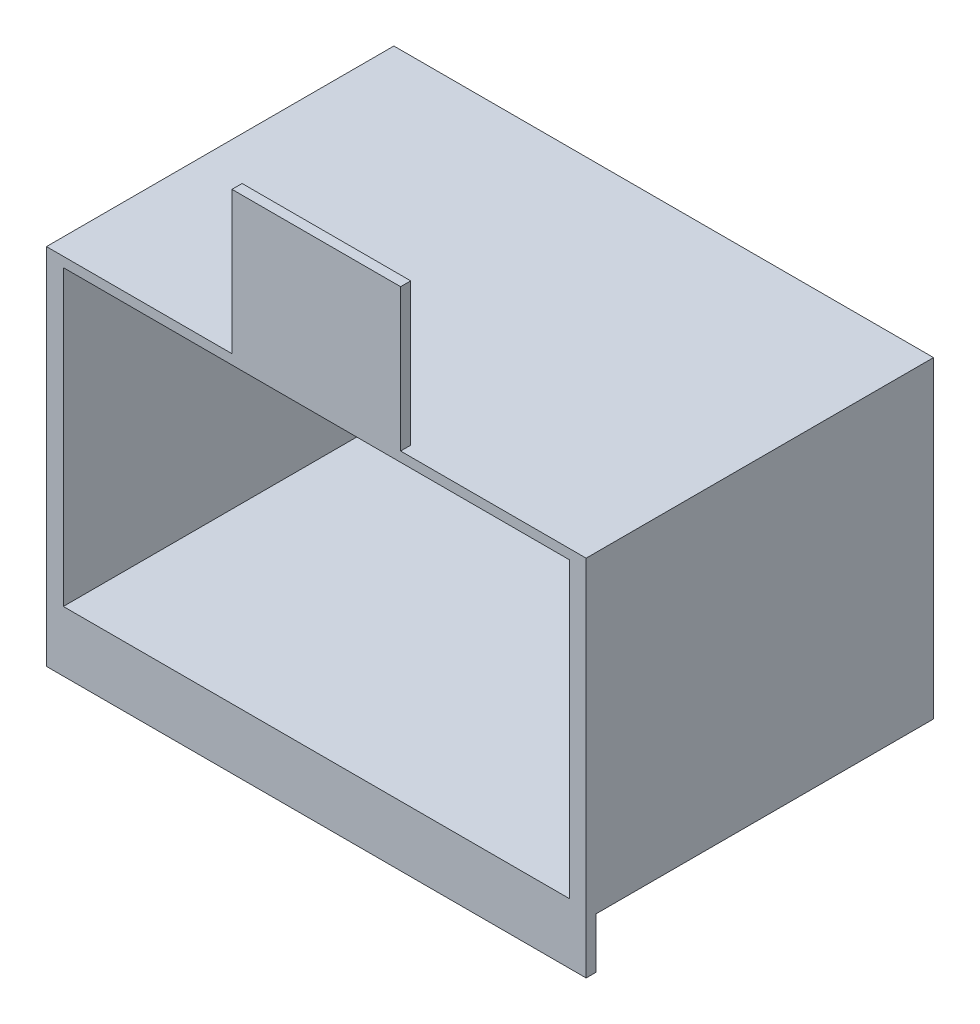
ISO-10303-21;
HEADER;
FILE_DESCRIPTION(('STEP AP214'),'2;1');
FILE_NAME('part.step','',(''),(''),'','','');
FILE_SCHEMA(('AUTOMOTIVE_DESIGN { 1 0 10303 214 1 1 1 1 }'));
ENDSEC;
DATA;
#1=APPLICATION_CONTEXT('core data for automotive mechanical design processes');
#2=APPLICATION_PROTOCOL_DEFINITION('international standard','automotive_design',2000,#1);
#3=PRODUCT_CONTEXT('',#1,'mechanical');
#4=PRODUCT('Part','Part','',(#3));
#5=PRODUCT_RELATED_PRODUCT_CATEGORY('part','',(#4));
#6=PRODUCT_DEFINITION_FORMATION('','',#4);
#7=PRODUCT_DEFINITION_CONTEXT('part definition',#1,'design');
#8=PRODUCT_DEFINITION('design','',#6,#7);
#9=PRODUCT_DEFINITION_SHAPE('','',#8);
#10=(LENGTH_UNIT() NAMED_UNIT(*) SI_UNIT(.MILLI.,.METRE.));
#11=(NAMED_UNIT(*) PLANE_ANGLE_UNIT() SI_UNIT($,.RADIAN.));
#12=(NAMED_UNIT(*) SI_UNIT($,.STERADIAN.) SOLID_ANGLE_UNIT());
#13=UNCERTAINTY_MEASURE_WITH_UNIT(LENGTH_MEASURE(1.E-05),#10,'distance_accuracy_value','');
#14=(GEOMETRIC_REPRESENTATION_CONTEXT(3) GLOBAL_UNCERTAINTY_ASSIGNED_CONTEXT((#13)) GLOBAL_UNIT_ASSIGNED_CONTEXT((#10,
#11,#12)) REPRESENTATION_CONTEXT('',''));
#15=CARTESIAN_POINT('',(0.,0.,0.));
#16=DIRECTION('',(0.,0.,1.));
#17=DIRECTION('',(1.,0.,0.));
#18=AXIS2_PLACEMENT_3D('',#15,#16,#17);
#19=CARTESIAN_POINT('',(80.,75.,3.));
#20=DIRECTION('',(-1.,0.,0.));
#21=DIRECTION('',(0.,-1.,0.));
#22=AXIS2_PLACEMENT_3D('',#19,#20,#21);
#23=PLANE('',#22);
#24=DIRECTION('',(0.,0.,-1.));
#25=VECTOR('',#24,1.);
#26=CARTESIAN_POINT('',(80.,-60.,103.));
#27=LINE('',#26,#25);
#28=CARTESIAN_POINT('',(80.,-60.,100.));
#29=VERTEX_POINT('',#28);
#30=CARTESIAN_POINT('',(80.,-60.,0.));
#31=VERTEX_POINT('',#30);
#32=EDGE_CURVE('E138',#29,#31,#27,.T.);
#33=ORIENTED_EDGE('',*,*,#32,.T.);
#34=DIRECTION('',(0.,1.,0.));
#35=VECTOR('',#34,1.);
#36=CARTESIAN_POINT('',(80.,75.,0.));
#37=LINE('',#36,#35);
#38=CARTESIAN_POINT('',(80.,32.8,0.));
#39=VERTEX_POINT('',#38);
#40=EDGE_CURVE('E44',#31,#39,#37,.T.);
#41=ORIENTED_EDGE('',*,*,#40,.T.);
#42=DIRECTION('',(0.,0.,-1.));
#43=VECTOR('',#42,1.);
#44=CARTESIAN_POINT('',(80.,32.8,103.));
#45=LINE('',#44,#43);
#46=CARTESIAN_POINT('',(80.,32.8,103.));
#47=VERTEX_POINT('',#46);
#48=EDGE_CURVE('E156',#47,#39,#45,.T.);
#49=ORIENTED_EDGE('',*,*,#48,.F.);
#50=DIRECTION('',(0.,1.,0.));
#51=VECTOR('',#50,1.);
#52=CARTESIAN_POINT('',(80.,32.8,103.));
#53=LINE('',#52,#51);
#54=CARTESIAN_POINT('',(80.,-75.,103.));
#55=VERTEX_POINT('',#54);
#56=EDGE_CURVE('E167',#55,#47,#53,.T.);
#57=ORIENTED_EDGE('',*,*,#56,.F.);
#58=DIRECTION('',(0.,0.,-1.));
#59=VECTOR('',#58,1.);
#60=CARTESIAN_POINT('',(80.,-75.,103.));
#61=LINE('',#60,#59);
#62=CARTESIAN_POINT('',(80.,-75.,100.));
#63=VERTEX_POINT('',#62);
#64=EDGE_CURVE('E202',#55,#63,#61,.T.);
#65=ORIENTED_EDGE('',*,*,#64,.T.);
#66=DIRECTION('',(0.,-1.,0.));
#67=VECTOR('',#66,1.);
#68=CARTESIAN_POINT('',(80.,-75.,100.));
#69=LINE('',#68,#67);
#70=EDGE_CURVE('E143',#29,#63,#69,.T.);
#71=ORIENTED_EDGE('',*,*,#70,.F.);
#72=EDGE_LOOP('',(#33,#41,#49,#57,#65,#71));
#73=FACE_BOUND('',#72,.T.);
#74=ADVANCED_FACE('F37',(#73),#23,.F.);
#75=CARTESIAN_POINT('',(-80.,75.,3.));
#76=DIRECTION('',(1.,0.,0.));
#77=DIRECTION('',(0.,1.,0.));
#78=AXIS2_PLACEMENT_3D('',#75,#76,#77);
#79=PLANE('',#78);
#80=DIRECTION('',(0.,-1.,0.));
#81=VECTOR('',#80,1.);
#82=CARTESIAN_POINT('',(-80.,75.,0.));
#83=LINE('',#82,#81);
#84=CARTESIAN_POINT('',(-80.,32.8,0.));
#85=VERTEX_POINT('',#84);
#86=CARTESIAN_POINT('',(-80.,-60.,0.));
#87=VERTEX_POINT('',#86);
#88=EDGE_CURVE('E11',#85,#87,#83,.T.);
#89=ORIENTED_EDGE('',*,*,#88,.T.);
#90=DIRECTION('',(0.,0.,-1.));
#91=VECTOR('',#90,1.);
#92=CARTESIAN_POINT('',(-80.,-60.,103.));
#93=LINE('',#92,#91);
#94=CARTESIAN_POINT('',(-80.,-60.,100.));
#95=VERTEX_POINT('',#94);
#96=EDGE_CURVE('E51',#95,#87,#93,.T.);
#97=ORIENTED_EDGE('',*,*,#96,.F.);
#98=DIRECTION('',(0.,1.,0.));
#99=VECTOR('',#98,1.);
#100=CARTESIAN_POINT('',(-80.,-60.,100.));
#101=LINE('',#100,#99);
#102=CARTESIAN_POINT('',(-80.,-75.,100.));
#103=VERTEX_POINT('',#102);
#104=EDGE_CURVE('E208',#103,#95,#101,.T.);
#105=ORIENTED_EDGE('',*,*,#104,.F.);
#106=DIRECTION('',(0.,0.,-1.));
#107=VECTOR('',#106,1.);
#108=CARTESIAN_POINT('',(-80.,-75.,103.));
#109=LINE('',#108,#107);
#110=CARTESIAN_POINT('',(-80.,-75.,103.));
#111=VERTEX_POINT('',#110);
#112=EDGE_CURVE('E201',#111,#103,#109,.T.);
#113=ORIENTED_EDGE('',*,*,#112,.F.);
#114=DIRECTION('',(0.,-1.,0.));
#115=VECTOR('',#114,1.);
#116=CARTESIAN_POINT('',(-80.,32.8,103.));
#117=LINE('',#116,#115);
#118=CARTESIAN_POINT('',(-80.,32.8,103.));
#119=VERTEX_POINT('',#118);
#120=EDGE_CURVE('E145',#119,#111,#117,.T.);
#121=ORIENTED_EDGE('',*,*,#120,.F.);
#122=DIRECTION('',(0.,0.,-1.));
#123=VECTOR('',#122,1.);
#124=CARTESIAN_POINT('',(-80.,32.8,103.));
#125=LINE('',#124,#123);
#126=EDGE_CURVE('E157',#119,#85,#125,.T.);
#127=ORIENTED_EDGE('',*,*,#126,.T.);
#128=EDGE_LOOP('',(#89,#97,#105,#113,#121,#127));
#129=FACE_BOUND('',#128,.T.);
#130=ADVANCED_FACE('F266',(#129),#79,.F.);
#131=CARTESIAN_POINT('',(0.,0.,0.));
#132=DIRECTION('',(0.,0.,1.));
#133=DIRECTION('',(1.,0.,0.));
#134=AXIS2_PLACEMENT_3D('',#131,#132,#133);
#135=PLANE('',#134);
#136=DIRECTION('',(1.,0.,0.));
#137=VECTOR('',#136,1.);
#138=CARTESIAN_POINT('',(80.,-60.,0.));
#139=LINE('',#138,#137);
#140=EDGE_CURVE('E147',#87,#31,#139,.T.);
#141=ORIENTED_EDGE('',*,*,#140,.F.);
#142=ORIENTED_EDGE('',*,*,#88,.F.);
#143=DIRECTION('',(1.,0.,0.));
#144=VECTOR('',#143,1.);
#145=CARTESIAN_POINT('',(-80.,32.8,0.));
#146=LINE('',#145,#144);
#147=EDGE_CURVE('E155',#85,#39,#146,.T.);
#148=ORIENTED_EDGE('',*,*,#147,.T.);
#149=ORIENTED_EDGE('',*,*,#40,.F.);
#150=EDGE_LOOP('',(#141,#142,#148,#149));
#151=FACE_BOUND('',#150,.T.);
#152=ADVANCED_FACE('F153',(#151),#135,.F.);
#153=CARTESIAN_POINT('',(-80.,-60.,103.));
#154=DIRECTION('',(0.,1.,0.));
#155=DIRECTION('',(-1.,0.,0.));
#156=AXIS2_PLACEMENT_3D('',#153,#154,#155);
#157=PLANE('',#156);
#158=DIRECTION('',(1.,0.,0.));
#159=VECTOR('',#158,1.);
#160=CARTESIAN_POINT('',(80.,-60.,100.));
#161=LINE('',#160,#159);
#162=EDGE_CURVE('E206',#95,#29,#161,.T.);
#163=ORIENTED_EDGE('',*,*,#162,.F.);
#164=ORIENTED_EDGE('',*,*,#96,.T.);
#165=ORIENTED_EDGE('',*,*,#140,.T.);
#166=ORIENTED_EDGE('',*,*,#32,.F.);
#167=EDGE_LOOP('',(#163,#164,#165,#166));
#168=FACE_BOUND('',#167,.T.);
#169=ADVANCED_FACE('F148',(#168),#157,.F.);
#170=CARTESIAN_POINT('',(0.,0.,103.));
#171=DIRECTION('',(0.,0.,1.));
#172=DIRECTION('',(1.,0.,0.));
#173=AXIS2_PLACEMENT_3D('',#170,#171,#172);
#174=PLANE('',#173);
#175=ORIENTED_EDGE('',*,*,#56,.T.);
#176=DIRECTION('',(-1.,0.,0.));
#177=VECTOR('',#176,1.);
#178=CARTESIAN_POINT('',(-80.,32.8,103.));
#179=LINE('',#178,#177);
#180=CARTESIAN_POINT('',(25.,32.8,103.));
#181=VERTEX_POINT('',#180);
#182=EDGE_CURVE('E163',#47,#181,#179,.T.);
#183=ORIENTED_EDGE('',*,*,#182,.T.);
#184=DIRECTION('',(0.,-1.,0.));
#185=VECTOR('',#184,1.);
#186=CARTESIAN_POINT('',(25.,32.8,103.));
#187=LINE('',#186,#185);
#188=CARTESIAN_POINT('',(25.,75.,103.));
#189=VERTEX_POINT('',#188);
#190=EDGE_CURVE('E238',#189,#181,#187,.T.);
#191=ORIENTED_EDGE('',*,*,#190,.F.);
#192=DIRECTION('',(1.,0.,0.));
#193=VECTOR('',#192,1.);
#194=CARTESIAN_POINT('',(25.,75.,103.));
#195=LINE('',#194,#193);
#196=CARTESIAN_POINT('',(-25.,75.,103.));
#197=VERTEX_POINT('',#196);
#198=EDGE_CURVE('E229',#197,#189,#195,.T.);
#199=ORIENTED_EDGE('',*,*,#198,.F.);
#200=DIRECTION('',(0.,1.,0.));
#201=VECTOR('',#200,1.);
#202=CARTESIAN_POINT('',(-25.,75.,103.));
#203=LINE('',#202,#201);
#204=CARTESIAN_POINT('',(-25.,32.8,103.));
#205=VERTEX_POINT('',#204);
#206=EDGE_CURVE('E221',#205,#197,#203,.T.);
#207=ORIENTED_EDGE('',*,*,#206,.F.);
#208=EDGE_CURVE('E166',#205,#119,#179,.T.);
#209=ORIENTED_EDGE('',*,*,#208,.T.);
#210=ORIENTED_EDGE('',*,*,#120,.T.);
#211=DIRECTION('',(-1.,0.,0.));
#212=VECTOR('',#211,1.);
#213=CARTESIAN_POINT('',(-80.,-75.,103.));
#214=LINE('',#213,#212);
#215=EDGE_CURVE('E204',#55,#111,#214,.T.);
#216=ORIENTED_EDGE('',*,*,#215,.F.);
#217=EDGE_LOOP('',(#175,#183,#191,#199,#207,#209,#210,#216));
#218=FACE_BOUND('',#217,.T.);
#219=DIRECTION('',(-1.,0.,0.));
#220=VECTOR('',#219,1.);
#221=CARTESIAN_POINT('',(-75.,29.9,103.));
#222=LINE('',#221,#220);
#223=CARTESIAN_POINT('',(75.,29.9,103.));
#224=VERTEX_POINT('',#223);
#225=CARTESIAN_POINT('',(-75.,29.9,103.));
#226=VERTEX_POINT('',#225);
#227=EDGE_CURVE('E197',#224,#226,#222,.T.);
#228=ORIENTED_EDGE('',*,*,#227,.F.);
#229=DIRECTION('',(0.,1.,0.));
#230=VECTOR('',#229,1.);
#231=CARTESIAN_POINT('',(75.,29.9,103.));
#232=LINE('',#231,#230);
#233=CARTESIAN_POINT('',(75.,-57.1,103.));
#234=VERTEX_POINT('',#233);
#235=EDGE_CURVE('E183',#234,#224,#232,.T.);
#236=ORIENTED_EDGE('',*,*,#235,.F.);
#237=DIRECTION('',(1.,0.,0.));
#238=VECTOR('',#237,1.);
#239=CARTESIAN_POINT('',(-75.,-57.1,103.));
#240=LINE('',#239,#238);
#241=CARTESIAN_POINT('',(-75.,-57.1,103.));
#242=VERTEX_POINT('',#241);
#243=EDGE_CURVE('E179',#242,#234,#240,.T.);
#244=ORIENTED_EDGE('',*,*,#243,.F.);
#245=DIRECTION('',(0.,-1.,0.));
#246=VECTOR('',#245,1.);
#247=CARTESIAN_POINT('',(-75.,29.9,103.));
#248=LINE('',#247,#246);
#249=EDGE_CURVE('E194',#226,#242,#248,.T.);
#250=ORIENTED_EDGE('',*,*,#249,.F.);
#251=EDGE_LOOP('',(#228,#236,#244,#250));
#252=FACE_BOUND('',#251,.T.);
#253=ADVANCED_FACE('F250',(#218,#252),#174,.T.);
#254=CARTESIAN_POINT('',(-80.,32.8,103.));
#255=DIRECTION('',(0.,-1.,0.));
#256=DIRECTION('',(1.,0.,0.));
#257=AXIS2_PLACEMENT_3D('',#254,#255,#256);
#258=PLANE('',#257);
#259=DIRECTION('',(-1.,0.,0.));
#260=VECTOR('',#259,1.);
#261=CARTESIAN_POINT('',(-25.,32.8,100.));
#262=LINE('',#261,#260);
#263=CARTESIAN_POINT('',(25.,32.8,100.));
#264=VERTEX_POINT('',#263);
#265=CARTESIAN_POINT('',(-25.,32.8,100.));
#266=VERTEX_POINT('',#265);
#267=EDGE_CURVE('E59',#264,#266,#262,.T.);
#268=ORIENTED_EDGE('',*,*,#267,.F.);
#269=DIRECTION('',(0.,0.,-1.));
#270=VECTOR('',#269,1.);
#271=CARTESIAN_POINT('',(25.,32.8,103.));
#272=LINE('',#271,#270);
#273=EDGE_CURVE('E220',#181,#264,#272,.T.);
#274=ORIENTED_EDGE('',*,*,#273,.F.);
#275=ORIENTED_EDGE('',*,*,#182,.F.);
#276=ORIENTED_EDGE('',*,*,#48,.T.);
#277=ORIENTED_EDGE('',*,*,#147,.F.);
#278=ORIENTED_EDGE('',*,*,#126,.F.);
#279=ORIENTED_EDGE('',*,*,#208,.F.);
#280=DIRECTION('',(0.,0.,-1.));
#281=VECTOR('',#280,1.);
#282=CARTESIAN_POINT('',(-25.,32.8,103.));
#283=LINE('',#282,#281);
#284=EDGE_CURVE('E223',#205,#266,#283,.T.);
#285=ORIENTED_EDGE('',*,*,#284,.T.);
#286=EDGE_LOOP('',(#268,#274,#275,#276,#277,#278,#279,#285));
#287=FACE_BOUND('',#286,.T.);
#288=ADVANCED_FACE('F256',(#287),#258,.F.);
#289=CARTESIAN_POINT('',(75.,29.9,103.));
#290=DIRECTION('',(-1.,0.,0.));
#291=DIRECTION('',(0.,-1.,0.));
#292=AXIS2_PLACEMENT_3D('',#289,#290,#291);
#293=PLANE('',#292);
#294=DIRECTION('',(0.,1.,0.));
#295=VECTOR('',#294,1.);
#296=CARTESIAN_POINT('',(75.,29.9,3.));
#297=LINE('',#296,#295);
#298=CARTESIAN_POINT('',(75.,-57.1,3.));
#299=VERTEX_POINT('',#298);
#300=CARTESIAN_POINT('',(75.,29.9,3.));
#301=VERTEX_POINT('',#300);
#302=EDGE_CURVE('E190',#299,#301,#297,.T.);
#303=ORIENTED_EDGE('',*,*,#302,.F.);
#304=DIRECTION('',(0.,0.,-1.));
#305=VECTOR('',#304,1.);
#306=CARTESIAN_POINT('',(75.,-57.1,103.));
#307=LINE('',#306,#305);
#308=EDGE_CURVE('E177',#234,#299,#307,.T.);
#309=ORIENTED_EDGE('',*,*,#308,.F.);
#310=ORIENTED_EDGE('',*,*,#235,.T.);
#311=DIRECTION('',(0.,0.,-1.));
#312=VECTOR('',#311,1.);
#313=CARTESIAN_POINT('',(75.,29.9,103.));
#314=LINE('',#313,#312);
#315=EDGE_CURVE('E170',#224,#301,#314,.T.);
#316=ORIENTED_EDGE('',*,*,#315,.T.);
#317=EDGE_LOOP('',(#303,#309,#310,#316));
#318=FACE_BOUND('',#317,.T.);
#319=ADVANCED_FACE('F298',(#318),#293,.T.);
#320=CARTESIAN_POINT('',(-75.,29.9,103.));
#321=DIRECTION('',(0.,-1.,0.));
#322=DIRECTION('',(1.,0.,0.));
#323=AXIS2_PLACEMENT_3D('',#320,#321,#322);
#324=PLANE('',#323);
#325=DIRECTION('',(-1.,0.,0.));
#326=VECTOR('',#325,1.);
#327=CARTESIAN_POINT('',(-75.,29.9,3.));
#328=LINE('',#327,#326);
#329=CARTESIAN_POINT('',(-75.,29.9,3.));
#330=VERTEX_POINT('',#329);
#331=EDGE_CURVE('E187',#301,#330,#328,.T.);
#332=ORIENTED_EDGE('',*,*,#331,.F.);
#333=ORIENTED_EDGE('',*,*,#315,.F.);
#334=ORIENTED_EDGE('',*,*,#227,.T.);
#335=DIRECTION('',(0.,0.,-1.));
#336=VECTOR('',#335,1.);
#337=CARTESIAN_POINT('',(-75.,29.9,103.));
#338=LINE('',#337,#336);
#339=EDGE_CURVE('E173',#226,#330,#338,.T.);
#340=ORIENTED_EDGE('',*,*,#339,.T.);
#341=EDGE_LOOP('',(#332,#333,#334,#340));
#342=FACE_BOUND('',#341,.T.);
#343=ADVANCED_FACE('F305',(#342),#324,.T.);
#344=CARTESIAN_POINT('',(-75.,29.9,103.));
#345=DIRECTION('',(1.,0.,0.));
#346=DIRECTION('',(0.,1.,0.));
#347=AXIS2_PLACEMENT_3D('',#344,#345,#346);
#348=PLANE('',#347);
#349=DIRECTION('',(0.,-1.,0.));
#350=VECTOR('',#349,1.);
#351=CARTESIAN_POINT('',(-75.,29.9,3.));
#352=LINE('',#351,#350);
#353=CARTESIAN_POINT('',(-75.,-57.1,3.));
#354=VERTEX_POINT('',#353);
#355=EDGE_CURVE('E184',#330,#354,#352,.T.);
#356=ORIENTED_EDGE('',*,*,#355,.F.);
#357=ORIENTED_EDGE('',*,*,#339,.F.);
#358=ORIENTED_EDGE('',*,*,#249,.T.);
#359=DIRECTION('',(0.,0.,-1.));
#360=VECTOR('',#359,1.);
#361=CARTESIAN_POINT('',(-75.,-57.1,103.));
#362=LINE('',#361,#360);
#363=EDGE_CURVE('E175',#242,#354,#362,.T.);
#364=ORIENTED_EDGE('',*,*,#363,.T.);
#365=EDGE_LOOP('',(#356,#357,#358,#364));
#366=FACE_BOUND('',#365,.T.);
#367=ADVANCED_FACE('F309',(#366),#348,.T.);
#368=CARTESIAN_POINT('',(-75.,-57.1,103.));
#369=DIRECTION('',(0.,1.,0.));
#370=DIRECTION('',(-1.,0.,0.));
#371=AXIS2_PLACEMENT_3D('',#368,#369,#370);
#372=PLANE('',#371);
#373=DIRECTION('',(1.,0.,0.));
#374=VECTOR('',#373,1.);
#375=CARTESIAN_POINT('',(-75.,-57.1,3.));
#376=LINE('',#375,#374);
#377=EDGE_CURVE('E180',#354,#299,#376,.T.);
#378=ORIENTED_EDGE('',*,*,#377,.F.);
#379=ORIENTED_EDGE('',*,*,#363,.F.);
#380=ORIENTED_EDGE('',*,*,#243,.T.);
#381=ORIENTED_EDGE('',*,*,#308,.T.);
#382=EDGE_LOOP('',(#378,#379,#380,#381));
#383=FACE_BOUND('',#382,.T.);
#384=ADVANCED_FACE('F294',(#383),#372,.T.);
#385=CARTESIAN_POINT('',(0.,0.,3.));
#386=DIRECTION('',(0.,0.,1.));
#387=DIRECTION('',(1.,0.,0.));
#388=AXIS2_PLACEMENT_3D('',#385,#386,#387);
#389=PLANE('',#388);
#390=ORIENTED_EDGE('',*,*,#377,.T.);
#391=ORIENTED_EDGE('',*,*,#302,.T.);
#392=ORIENTED_EDGE('',*,*,#331,.T.);
#393=ORIENTED_EDGE('',*,*,#355,.T.);
#394=EDGE_LOOP('',(#390,#391,#392,#393));
#395=FACE_BOUND('',#394,.T.);
#396=ADVANCED_FACE('F281',(#395),#389,.T.);
#397=CARTESIAN_POINT('',(-80.,-75.,103.));
#398=DIRECTION('',(0.,-1.,0.));
#399=DIRECTION('',(0.,0.,-1.));
#400=AXIS2_PLACEMENT_3D('',#397,#398,#399);
#401=PLANE('',#400);
#402=DIRECTION('',(-1.,0.,0.));
#403=VECTOR('',#402,1.);
#404=CARTESIAN_POINT('',(-80.,-75.,100.));
#405=LINE('',#404,#403);
#406=EDGE_CURVE('E211',#63,#103,#405,.T.);
#407=ORIENTED_EDGE('',*,*,#406,.F.);
#408=ORIENTED_EDGE('',*,*,#64,.F.);
#409=ORIENTED_EDGE('',*,*,#215,.T.);
#410=ORIENTED_EDGE('',*,*,#112,.T.);
#411=EDGE_LOOP('',(#407,#408,#409,#410));
#412=FACE_BOUND('',#411,.T.);
#413=ADVANCED_FACE('F271',(#412),#401,.T.);
#414=CARTESIAN_POINT('',(0.,0.,100.));
#415=DIRECTION('',(0.,0.,1.));
#416=DIRECTION('',(1.,0.,0.));
#417=AXIS2_PLACEMENT_3D('',#414,#415,#416);
#418=PLANE('',#417);
#419=ORIENTED_EDGE('',*,*,#70,.T.);
#420=ORIENTED_EDGE('',*,*,#406,.T.);
#421=ORIENTED_EDGE('',*,*,#104,.T.);
#422=ORIENTED_EDGE('',*,*,#162,.T.);
#423=EDGE_LOOP('',(#419,#420,#421,#422));
#424=FACE_BOUND('',#423,.T.);
#425=ADVANCED_FACE('F273',(#424),#418,.F.);
#426=CARTESIAN_POINT('',(25.,75.,103.));
#427=DIRECTION('',(0.,1.,0.));
#428=DIRECTION('',(0.,0.,1.));
#429=AXIS2_PLACEMENT_3D('',#426,#427,#428);
#430=PLANE('',#429);
#431=DIRECTION('',(1.,0.,0.));
#432=VECTOR('',#431,1.);
#433=CARTESIAN_POINT('',(25.,75.,100.));
#434=LINE('',#433,#432);
#435=CARTESIAN_POINT('',(-25.,75.,100.));
#436=VERTEX_POINT('',#435);
#437=CARTESIAN_POINT('',(25.,75.,100.));
#438=VERTEX_POINT('',#437);
#439=EDGE_CURVE('E151',#436,#438,#434,.T.);
#440=ORIENTED_EDGE('',*,*,#439,.F.);
#441=DIRECTION('',(0.,0.,-1.));
#442=VECTOR('',#441,1.);
#443=CARTESIAN_POINT('',(-25.,75.,103.));
#444=LINE('',#443,#442);
#445=EDGE_CURVE('E215',#197,#436,#444,.T.);
#446=ORIENTED_EDGE('',*,*,#445,.F.);
#447=ORIENTED_EDGE('',*,*,#198,.T.);
#448=DIRECTION('',(0.,0.,-1.));
#449=VECTOR('',#448,1.);
#450=CARTESIAN_POINT('',(25.,75.,103.));
#451=LINE('',#450,#449);
#452=EDGE_CURVE('E218',#189,#438,#451,.T.);
#453=ORIENTED_EDGE('',*,*,#452,.T.);
#454=EDGE_LOOP('',(#440,#446,#447,#453));
#455=FACE_BOUND('',#454,.T.);
#456=ADVANCED_FACE('F245',(#455),#430,.T.);
#457=CARTESIAN_POINT('',(-25.,75.,103.));
#458=DIRECTION('',(-1.,0.,0.));
#459=DIRECTION('',(0.,0.,1.));
#460=AXIS2_PLACEMENT_3D('',#457,#458,#459);
#461=PLANE('',#460);
#462=DIRECTION('',(0.,1.,0.));
#463=VECTOR('',#462,1.);
#464=CARTESIAN_POINT('',(-25.,75.,100.));
#465=LINE('',#464,#463);
#466=EDGE_CURVE('E226',#266,#436,#465,.T.);
#467=ORIENTED_EDGE('',*,*,#466,.F.);
#468=ORIENTED_EDGE('',*,*,#284,.F.);
#469=ORIENTED_EDGE('',*,*,#206,.T.);
#470=ORIENTED_EDGE('',*,*,#445,.T.);
#471=EDGE_LOOP('',(#467,#468,#469,#470));
#472=FACE_BOUND('',#471,.T.);
#473=ADVANCED_FACE('F255',(#472),#461,.T.);
#474=CARTESIAN_POINT('',(25.,32.8,103.));
#475=DIRECTION('',(1.,0.,0.));
#476=DIRECTION('',(0.,0.,-1.));
#477=AXIS2_PLACEMENT_3D('',#474,#475,#476);
#478=PLANE('',#477);
#479=DIRECTION('',(0.,-1.,0.));
#480=VECTOR('',#479,1.);
#481=CARTESIAN_POINT('',(25.,32.8,100.));
#482=LINE('',#481,#480);
#483=EDGE_CURVE('E231',#438,#264,#482,.T.);
#484=ORIENTED_EDGE('',*,*,#483,.F.);
#485=ORIENTED_EDGE('',*,*,#452,.F.);
#486=ORIENTED_EDGE('',*,*,#190,.T.);
#487=ORIENTED_EDGE('',*,*,#273,.T.);
#488=EDGE_LOOP('',(#484,#485,#486,#487));
#489=FACE_BOUND('',#488,.T.);
#490=ADVANCED_FACE('F261',(#489),#478,.T.);
#491=CARTESIAN_POINT('',(0.,0.,100.));
#492=DIRECTION('',(0.,0.,1.));
#493=DIRECTION('',(1.,0.,0.));
#494=AXIS2_PLACEMENT_3D('',#491,#492,#493);
#495=PLANE('',#494);
#496=ORIENTED_EDGE('',*,*,#439,.T.);
#497=ORIENTED_EDGE('',*,*,#483,.T.);
#498=ORIENTED_EDGE('',*,*,#267,.T.);
#499=ORIENTED_EDGE('',*,*,#466,.T.);
#500=EDGE_LOOP('',(#496,#497,#498,#499));
#501=FACE_BOUND('',#500,.T.);
#502=ADVANCED_FACE('F259',(#501),#495,.F.);
#503=CLOSED_SHELL('',(#74,#130,#152,#169,#253,#288,#319,#343,#367,#384,#396,#413,#425,#456,#473,
#490,#502));
#504=MANIFOLD_SOLID_BREP('B2',#503);
#505=ADVANCED_BREP_SHAPE_REPRESENTATION('',(#18,#504),#14);
#506=SHAPE_DEFINITION_REPRESENTATION(#9,#505);
ENDSEC;
END-ISO-10303-21;
